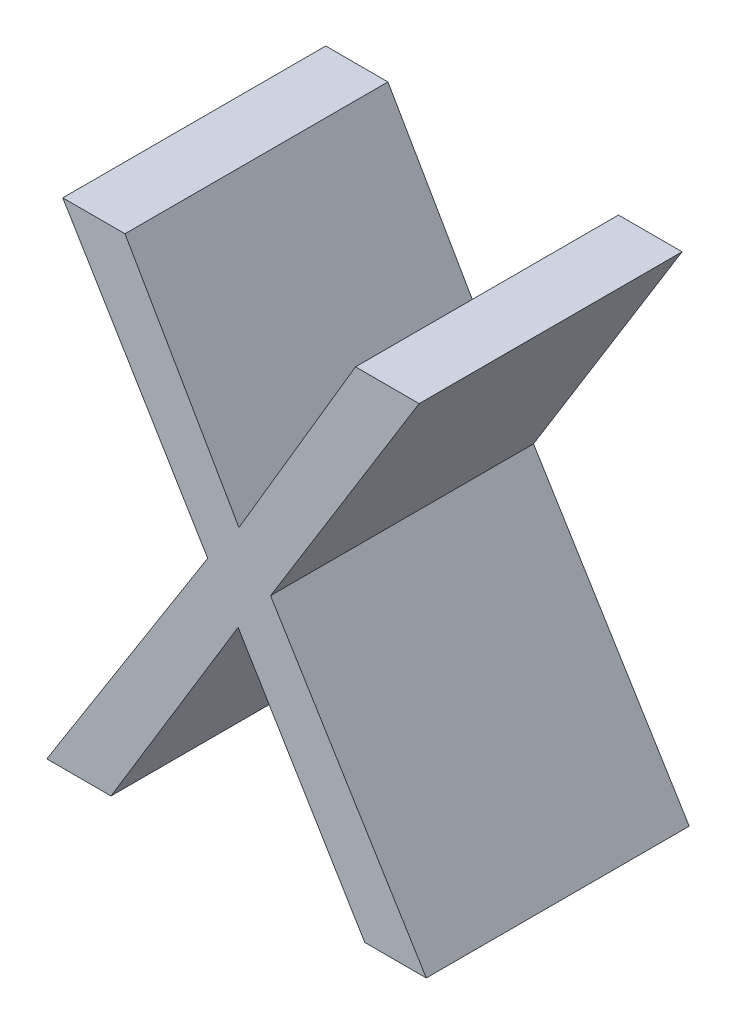
ISO-10303-21;
HEADER;
FILE_DESCRIPTION(('STEP AP214'),'2;1');
FILE_NAME('part.step','',(''),(''),'','','');
FILE_SCHEMA(('AUTOMOTIVE_DESIGN { 1 0 10303 214 1 1 1 1 }'));
ENDSEC;
DATA;
#1=APPLICATION_CONTEXT('core data for automotive mechanical design processes');
#2=APPLICATION_PROTOCOL_DEFINITION('international standard','automotive_design',2000,#1);
#3=PRODUCT_CONTEXT('',#1,'mechanical');
#4=PRODUCT('Part','Part','',(#3));
#5=PRODUCT_RELATED_PRODUCT_CATEGORY('part','',(#4));
#6=PRODUCT_DEFINITION_FORMATION('','',#4);
#7=PRODUCT_DEFINITION_CONTEXT('part definition',#1,'design');
#8=PRODUCT_DEFINITION('design','',#6,#7);
#9=PRODUCT_DEFINITION_SHAPE('','',#8);
#10=(LENGTH_UNIT() NAMED_UNIT(*) SI_UNIT(.MILLI.,.METRE.));
#11=(NAMED_UNIT(*) PLANE_ANGLE_UNIT() SI_UNIT($,.RADIAN.));
#12=(NAMED_UNIT(*) SI_UNIT($,.STERADIAN.) SOLID_ANGLE_UNIT());
#13=UNCERTAINTY_MEASURE_WITH_UNIT(LENGTH_MEASURE(1.E-05),#10,'distance_accuracy_value','');
#14=(GEOMETRIC_REPRESENTATION_CONTEXT(3) GLOBAL_UNCERTAINTY_ASSIGNED_CONTEXT((#13)) GLOBAL_UNIT_ASSIGNED_CONTEXT((#10,
#11,#12)) REPRESENTATION_CONTEXT('',''));
#15=CARTESIAN_POINT('',(0.,0.,0.));
#16=DIRECTION('',(0.,0.,1.));
#17=DIRECTION('',(1.,0.,0.));
#18=AXIS2_PLACEMENT_3D('',#15,#16,#17);
#19=CARTESIAN_POINT('',(-15.034738548345,-5.20300401796,-5.5));
#20=DIRECTION('',(0.,0.,1.));
#21=DIRECTION('',(0.,-1.,0.));
#22=AXIS2_PLACEMENT_3D('',#19,#20,#21);
#23=PLANE('',#22);
#24=DIRECTION('',(-0.523871496151556,0.85179730894147,0.));
#25=VECTOR('',#24,1.);
#26=CARTESIAN_POINT('',(-14.321526980301,-6.13847583919,-5.5));
#27=LINE('',#26,#25);
#28=CARTESIAN_POINT('',(-14.321526980301,-6.13847583919,-5.5));
#29=VERTEX_POINT('',#28);
#30=CARTESIAN_POINT('',(-14.913792891412,-5.175471528079,-5.5));
#31=VERTEX_POINT('',#30);
#32=EDGE_CURVE('E157',#29,#31,#27,.T.);
#33=ORIENTED_EDGE('',*,*,#32,.T.);
#34=DIRECTION('',(0.525450652449942,0.850824078079558,0.));
#35=VECTOR('',#34,1.);
#36=CARTESIAN_POINT('',(-14.913792891412,-5.175471528079,-5.5));
#37=LINE('',#36,#35);
#38=CARTESIAN_POINT('',(-14.348566691412,-4.260241794746,-5.5));
#39=VERTEX_POINT('',#38);
#40=EDGE_CURVE('E20',#31,#39,#37,.T.);
#41=ORIENTED_EDGE('',*,*,#40,.T.);
#42=DIRECTION('',(-1.,0.,0.));
#43=VECTOR('',#42,1.);
#44=CARTESIAN_POINT('',(-14.348566691412,-4.260241794746,-5.5));
#45=LINE('',#44,#43);
#46=CARTESIAN_POINT('',(-14.590614580301,-4.260241794746,-5.5));
#47=VERTEX_POINT('',#46);
#48=EDGE_CURVE('E167',#39,#47,#45,.T.);
#49=ORIENTED_EDGE('',*,*,#48,.T.);
#50=DIRECTION('',(-0.508285495192719,-0.86118862938191,0.));
#51=VECTOR('',#50,1.);
#52=CARTESIAN_POINT('',(-14.590614580301,-4.260241794746,-5.5));
#53=LINE('',#52,#51);
#54=CARTESIAN_POINT('',(-15.03388126919,-5.01126899474555,-5.5));
#55=VERTEX_POINT('',#54);
#56=EDGE_CURVE('E187',#47,#55,#53,.T.);
#57=ORIENTED_EDGE('',*,*,#56,.T.);
#58=DIRECTION('',(-0.499878349673019,0.866095627242269,0.));
#59=VECTOR('',#58,1.);
#60=CARTESIAN_POINT('',(-15.03388126919,-5.01126899474555,-5.5));
#61=LINE('',#60,#59);
#62=CARTESIAN_POINT('',(-15.467346380301,-4.260241794746,-5.5));
#63=VERTEX_POINT('',#62);
#64=EDGE_CURVE('E201',#55,#63,#61,.T.);
#65=ORIENTED_EDGE('',*,*,#64,.T.);
#66=DIRECTION('',(-1.,0.,0.));
#67=VECTOR('',#66,1.);
#68=CARTESIAN_POINT('',(-15.467346380301,-4.260241794746,-5.5));
#69=LINE('',#68,#67);
#70=CARTESIAN_POINT('',(-15.703953024746,-4.260241794746,-5.5));
#71=VERTEX_POINT('',#70);
#72=EDGE_CURVE('E171',#63,#71,#69,.T.);
#73=ORIENTED_EDGE('',*,*,#72,.T.);
#74=DIRECTION('',(0.517362494476925,-0.855766352054469,0.));
#75=VECTOR('',#74,1.);
#76=CARTESIAN_POINT('',(-15.703953024746,-4.260241794746,-5.5));
#77=LINE('',#76,#75);
#78=CARTESIAN_POINT('',(-15.152784313635,-5.171926816968,-5.5));
#79=VERTEX_POINT('',#78);
#80=EDGE_CURVE('E142',#71,#79,#77,.T.);
#81=ORIENTED_EDGE('',*,*,#80,.T.);
#82=DIRECTION('',(-0.534969795289568,-0.84487118433986,0.));
#83=VECTOR('',#82,1.);
#84=CARTESIAN_POINT('',(-15.152784313635,-5.171926816968,-5.5));
#85=LINE('',#84,#83);
#86=CARTESIAN_POINT('',(-15.764800135857,-6.13847583919,-5.5));
#87=VERTEX_POINT('',#86);
#88=EDGE_CURVE('E126',#79,#87,#85,.T.);
#89=ORIENTED_EDGE('',*,*,#88,.T.);
#90=DIRECTION('',(1.,0.,0.));
#91=VECTOR('',#90,1.);
#92=CARTESIAN_POINT('',(-15.764800135857,-6.13847583919,-5.5));
#93=LINE('',#92,#91);
#94=CARTESIAN_POINT('',(-15.520500113635,-6.13847583919,-5.5));
#95=VERTEX_POINT('',#94);
#96=EDGE_CURVE('E132',#87,#95,#93,.T.);
#97=ORIENTED_EDGE('',*,*,#96,.T.);
#98=DIRECTION('',(0.518670020840152,0.854974508088795,0.));
#99=VECTOR('',#98,1.);
#100=CARTESIAN_POINT('',(-15.520500113635,-6.13847583919,-5.5));
#101=LINE('',#100,#99);
#102=CARTESIAN_POINT('',(-15.037073202523,-5.341595994746,-5.5));
#103=VERTEX_POINT('',#102);
#104=EDGE_CURVE('E213',#95,#103,#101,.T.);
#105=ORIENTED_EDGE('',*,*,#104,.T.);
#106=DIRECTION('',(0.51733345020432,-0.855783910400105,0.));
#107=VECTOR('',#106,1.);
#108=CARTESIAN_POINT('',(-15.037073202523,-5.341595994746,-5.5));
#109=LINE('',#108,#107);
#110=CARTESIAN_POINT('',(-14.555348091412,-6.13847583919,-5.5));
#111=VERTEX_POINT('',#110);
#112=EDGE_CURVE('E214',#103,#111,#109,.T.);
#113=ORIENTED_EDGE('',*,*,#112,.T.);
#114=DIRECTION('',(1.,0.,0.));
#115=VECTOR('',#114,1.);
#116=CARTESIAN_POINT('',(-14.555348091412,-6.13847583919,-5.5));
#117=LINE('',#116,#115);
#118=EDGE_CURVE('E11',#111,#29,#117,.T.);
#119=ORIENTED_EDGE('',*,*,#118,.T.);
#120=EDGE_LOOP('',(#33,#41,#49,#57,#65,#73,#81,#89,#97,#105,#113,#119));
#121=FACE_BOUND('',#120,.T.);
#122=ADVANCED_FACE('F16',(#121),#23,.T.);
#123=CARTESIAN_POINT('',(-15.034738548345,-5.20300401796,-6.5));
#124=DIRECTION('',(0.,0.,1.));
#125=DIRECTION('',(0.,-1.,0.));
#126=AXIS2_PLACEMENT_3D('',#123,#124,#125);
#127=PLANE('',#126);
#128=DIRECTION('',(-0.523871496151556,0.85179730894147,0.));
#129=VECTOR('',#128,1.);
#130=CARTESIAN_POINT('',(-14.321526980301,-6.13847583919,-6.5));
#131=LINE('',#130,#129);
#132=CARTESIAN_POINT('',(-14.321526980301,-6.13847583919,-6.5));
#133=VERTEX_POINT('',#132);
#134=CARTESIAN_POINT('',(-14.913792891412,-5.175471528079,-6.5));
#135=VERTEX_POINT('',#134);
#136=EDGE_CURVE('E192',#133,#135,#131,.T.);
#137=ORIENTED_EDGE('',*,*,#136,.F.);
#138=DIRECTION('',(1.,0.,0.));
#139=VECTOR('',#138,1.);
#140=CARTESIAN_POINT('',(-14.555348091412,-6.13847583919,-6.5));
#141=LINE('',#140,#139);
#142=CARTESIAN_POINT('',(-14.555348091412,-6.13847583919,-6.5));
#143=VERTEX_POINT('',#142);
#144=EDGE_CURVE('E27',#143,#133,#141,.T.);
#145=ORIENTED_EDGE('',*,*,#144,.F.);
#146=DIRECTION('',(0.51733345020432,-0.855783910400105,0.));
#147=VECTOR('',#146,1.);
#148=CARTESIAN_POINT('',(-15.037073202523,-5.341595994746,-6.5));
#149=LINE('',#148,#147);
#150=CARTESIAN_POINT('',(-15.037073202523,-5.341595994746,-6.5));
#151=VERTEX_POINT('',#150);
#152=EDGE_CURVE('E208',#151,#143,#149,.T.);
#153=ORIENTED_EDGE('',*,*,#152,.F.);
#154=DIRECTION('',(0.518670020840152,0.854974508088795,0.));
#155=VECTOR('',#154,1.);
#156=CARTESIAN_POINT('',(-15.520500113635,-6.13847583919,-6.5));
#157=LINE('',#156,#155);
#158=CARTESIAN_POINT('',(-15.520500113635,-6.13847583919,-6.5));
#159=VERTEX_POINT('',#158);
#160=EDGE_CURVE('E120',#159,#151,#157,.T.);
#161=ORIENTED_EDGE('',*,*,#160,.F.);
#162=DIRECTION('',(1.,0.,0.));
#163=VECTOR('',#162,1.);
#164=CARTESIAN_POINT('',(-15.764800135857,-6.13847583919,-6.5));
#165=LINE('',#164,#163);
#166=CARTESIAN_POINT('',(-15.764800135857,-6.13847583919,-6.5));
#167=VERTEX_POINT('',#166);
#168=EDGE_CURVE('E112',#167,#159,#165,.T.);
#169=ORIENTED_EDGE('',*,*,#168,.F.);
#170=DIRECTION('',(-0.534969795289568,-0.84487118433986,0.));
#171=VECTOR('',#170,1.);
#172=CARTESIAN_POINT('',(-15.152784313635,-5.171926816968,-6.5));
#173=LINE('',#172,#171);
#174=CARTESIAN_POINT('',(-15.152784313635,-5.171926816968,-6.5));
#175=VERTEX_POINT('',#174);
#176=EDGE_CURVE('E117',#175,#167,#173,.T.);
#177=ORIENTED_EDGE('',*,*,#176,.F.);
#178=DIRECTION('',(0.517362494476925,-0.855766352054469,0.));
#179=VECTOR('',#178,1.);
#180=CARTESIAN_POINT('',(-15.703953024746,-4.260241794746,-6.5));
#181=LINE('',#180,#179);
#182=CARTESIAN_POINT('',(-15.703953024746,-4.260241794746,-6.5));
#183=VERTEX_POINT('',#182);
#184=EDGE_CURVE('E168',#183,#175,#181,.T.);
#185=ORIENTED_EDGE('',*,*,#184,.F.);
#186=DIRECTION('',(-1.,0.,0.));
#187=VECTOR('',#186,1.);
#188=CARTESIAN_POINT('',(-15.467346380301,-4.260241794746,-6.5));
#189=LINE('',#188,#187);
#190=CARTESIAN_POINT('',(-15.467346380301,-4.260241794746,-6.5));
#191=VERTEX_POINT('',#190);
#192=EDGE_CURVE('E182',#191,#183,#189,.T.);
#193=ORIENTED_EDGE('',*,*,#192,.F.);
#194=DIRECTION('',(-0.499878349673019,0.866095627242269,0.));
#195=VECTOR('',#194,1.);
#196=CARTESIAN_POINT('',(-15.03388126919,-5.01126899474555,-6.5));
#197=LINE('',#196,#195);
#198=CARTESIAN_POINT('',(-15.03388126919,-5.01126899474555,-6.5));
#199=VERTEX_POINT('',#198);
#200=EDGE_CURVE('E183',#199,#191,#197,.T.);
#201=ORIENTED_EDGE('',*,*,#200,.F.);
#202=DIRECTION('',(-0.508285495192719,-0.86118862938191,0.));
#203=VECTOR('',#202,1.);
#204=CARTESIAN_POINT('',(-14.590614580301,-4.260241794746,-6.5));
#205=LINE('',#204,#203);
#206=CARTESIAN_POINT('',(-14.590614580301,-4.260241794746,-6.5));
#207=VERTEX_POINT('',#206);
#208=EDGE_CURVE('E162',#207,#199,#205,.T.);
#209=ORIENTED_EDGE('',*,*,#208,.F.);
#210=DIRECTION('',(-1.,0.,0.));
#211=VECTOR('',#210,1.);
#212=CARTESIAN_POINT('',(-14.348566691412,-4.260241794746,-6.5));
#213=LINE('',#212,#211);
#214=CARTESIAN_POINT('',(-14.348566691412,-4.260241794746,-6.5));
#215=VERTEX_POINT('',#214);
#216=EDGE_CURVE('E204',#215,#207,#213,.T.);
#217=ORIENTED_EDGE('',*,*,#216,.F.);
#218=DIRECTION('',(0.525450652449942,0.850824078079558,0.));
#219=VECTOR('',#218,1.);
#220=CARTESIAN_POINT('',(-14.913792891412,-5.175471528079,-6.5));
#221=LINE('',#220,#219);
#222=EDGE_CURVE('E156',#135,#215,#221,.T.);
#223=ORIENTED_EDGE('',*,*,#222,.F.);
#224=EDGE_LOOP('',(#137,#145,#153,#161,#169,#177,#185,#193,#201,#209,#217,#223));
#225=FACE_BOUND('',#224,.T.);
#226=ADVANCED_FACE('F115',(#225),#127,.F.);
#227=CARTESIAN_POINT('',(-14.4384375358565,-6.13847583919,-5.49));
#228=DIRECTION('',(0.,1.,0.));
#229=DIRECTION('',(-1.,0.,0.));
#230=AXIS2_PLACEMENT_3D('',#227,#228,#229);
#231=PLANE('',#230);
#232=DIRECTION('',(0.,0.,1.));
#233=VECTOR('',#232,1.);
#234=CARTESIAN_POINT('',(-14.555348091412,-6.13847583919,-6.5));
#235=LINE('',#234,#233);
#236=EDGE_CURVE('E212',#143,#111,#235,.T.);
#237=ORIENTED_EDGE('',*,*,#236,.F.);
#238=ORIENTED_EDGE('',*,*,#144,.T.);
#239=DIRECTION('',(0.,0.,1.));
#240=VECTOR('',#239,1.);
#241=CARTESIAN_POINT('',(-14.321526980301,-6.13847583919,-6.5));
#242=LINE('',#241,#240);
#243=EDGE_CURVE('E236',#133,#29,#242,.T.);
#244=ORIENTED_EDGE('',*,*,#243,.T.);
#245=ORIENTED_EDGE('',*,*,#118,.F.);
#246=EDGE_LOOP('',(#237,#238,#244,#245));
#247=FACE_BOUND('',#246,.T.);
#248=ADVANCED_FACE('F18',(#247),#231,.F.);
#249=CARTESIAN_POINT('',(-14.7962106469675,-5.740035916968,-5.49));
#250=DIRECTION('',(0.855783910400104,0.517333450204322,0.));
#251=DIRECTION('',(0.,0.,-1.));
#252=AXIS2_PLACEMENT_3D('',#249,#250,#251);
#253=PLANE('',#252);
#254=DIRECTION('',(0.,0.,1.));
#255=VECTOR('',#254,1.);
#256=CARTESIAN_POINT('',(-15.037073202523,-5.341595994746,-6.5));
#257=LINE('',#256,#255);
#258=EDGE_CURVE('E219',#151,#103,#257,.T.);
#259=ORIENTED_EDGE('',*,*,#258,.F.);
#260=ORIENTED_EDGE('',*,*,#152,.T.);
#261=ORIENTED_EDGE('',*,*,#236,.T.);
#262=ORIENTED_EDGE('',*,*,#112,.F.);
#263=EDGE_LOOP('',(#259,#260,#261,#262));
#264=FACE_BOUND('',#263,.T.);
#265=ADVANCED_FACE('F234',(#264),#253,.F.);
#266=CARTESIAN_POINT('',(-15.278786658079,-5.740035916968,-5.49));
#267=DIRECTION('',(-0.854974508088793,0.518670020840154,0.));
#268=DIRECTION('',(0.,0.,1.));
#269=AXIS2_PLACEMENT_3D('',#266,#267,#268);
#270=PLANE('',#269);
#271=DIRECTION('',(0.,0.,1.));
#272=VECTOR('',#271,1.);
#273=CARTESIAN_POINT('',(-15.520500113635,-6.13847583919,-6.5));
#274=LINE('',#273,#272);
#275=EDGE_CURVE('E125',#159,#95,#274,.T.);
#276=ORIENTED_EDGE('',*,*,#275,.F.);
#277=ORIENTED_EDGE('',*,*,#160,.T.);
#278=ORIENTED_EDGE('',*,*,#258,.T.);
#279=ORIENTED_EDGE('',*,*,#104,.F.);
#280=EDGE_LOOP('',(#276,#277,#278,#279));
#281=FACE_BOUND('',#280,.T.);
#282=ADVANCED_FACE('F308',(#281),#270,.F.);
#283=CARTESIAN_POINT('',(-15.642650124746,-6.13847583919,-5.49));
#284=DIRECTION('',(0.,1.,0.));
#285=DIRECTION('',(-1.,0.,0.));
#286=AXIS2_PLACEMENT_3D('',#283,#284,#285);
#287=PLANE('',#286);
#288=DIRECTION('',(0.,0.,1.));
#289=VECTOR('',#288,1.);
#290=CARTESIAN_POINT('',(-15.764800135857,-6.13847583919,-6.5));
#291=LINE('',#290,#289);
#292=EDGE_CURVE('E129',#167,#87,#291,.T.);
#293=ORIENTED_EDGE('',*,*,#292,.F.);
#294=ORIENTED_EDGE('',*,*,#168,.T.);
#295=ORIENTED_EDGE('',*,*,#275,.T.);
#296=ORIENTED_EDGE('',*,*,#96,.F.);
#297=EDGE_LOOP('',(#293,#294,#295,#296));
#298=FACE_BOUND('',#297,.T.);
#299=ADVANCED_FACE('F130',(#298),#287,.F.);
#300=CARTESIAN_POINT('',(-15.458792224746,-5.655201328079,-5.49));
#301=DIRECTION('',(0.84487118433986,-0.534969795289569,0.));
#302=DIRECTION('',(0.534969795289569,0.84487118433986,0.));
#303=AXIS2_PLACEMENT_3D('',#300,#301,#302);
#304=PLANE('',#303);
#305=DIRECTION('',(0.,0.,1.));
#306=VECTOR('',#305,1.);
#307=CARTESIAN_POINT('',(-15.152784313635,-5.171926816968,-6.5));
#308=LINE('',#307,#306);
#309=EDGE_CURVE('E139',#175,#79,#308,.T.);
#310=ORIENTED_EDGE('',*,*,#309,.F.);
#311=ORIENTED_EDGE('',*,*,#176,.T.);
#312=ORIENTED_EDGE('',*,*,#292,.T.);
#313=ORIENTED_EDGE('',*,*,#88,.F.);
#314=EDGE_LOOP('',(#310,#311,#312,#313));
#315=FACE_BOUND('',#314,.T.);
#316=ADVANCED_FACE('F137',(#315),#304,.F.);
#317=CARTESIAN_POINT('',(-15.4283686691905,-4.716084305857,-5.49));
#318=DIRECTION('',(0.855766352054469,0.517362494476925,0.));
#319=DIRECTION('',(0.,0.,-1.));
#320=AXIS2_PLACEMENT_3D('',#317,#318,#319);
#321=PLANE('',#320);
#322=DIRECTION('',(0.,0.,1.));
#323=VECTOR('',#322,1.);
#324=CARTESIAN_POINT('',(-15.703953024746,-4.260241794746,-6.5));
#325=LINE('',#324,#323);
#326=EDGE_CURVE('E178',#183,#71,#325,.T.);
#327=ORIENTED_EDGE('',*,*,#326,.F.);
#328=ORIENTED_EDGE('',*,*,#184,.T.);
#329=ORIENTED_EDGE('',*,*,#309,.T.);
#330=ORIENTED_EDGE('',*,*,#80,.F.);
#331=EDGE_LOOP('',(#327,#328,#329,#330));
#332=FACE_BOUND('',#331,.T.);
#333=ADVANCED_FACE('F272',(#332),#321,.F.);
#334=CARTESIAN_POINT('',(-15.5856497025235,-4.260241794746,-5.49));
#335=DIRECTION('',(0.,-1.,0.));
#336=DIRECTION('',(0.,0.,1.));
#337=AXIS2_PLACEMENT_3D('',#334,#335,#336);
#338=PLANE('',#337);
#339=DIRECTION('',(0.,0.,1.));
#340=VECTOR('',#339,1.);
#341=CARTESIAN_POINT('',(-15.467346380301,-4.260241794746,-6.5));
#342=LINE('',#341,#340);
#343=EDGE_CURVE('E186',#191,#63,#342,.T.);
#344=ORIENTED_EDGE('',*,*,#343,.F.);
#345=ORIENTED_EDGE('',*,*,#192,.T.);
#346=ORIENTED_EDGE('',*,*,#326,.T.);
#347=ORIENTED_EDGE('',*,*,#72,.F.);
#348=EDGE_LOOP('',(#344,#345,#346,#347));
#349=FACE_BOUND('',#348,.T.);
#350=ADVANCED_FACE('F270',(#349),#338,.F.);
#351=CARTESIAN_POINT('',(-15.2506138247455,-4.63575539474578,-5.49));
#352=DIRECTION('',(-0.866095627242269,-0.499878349673019,0.));
#353=DIRECTION('',(0.,0.,1.));
#354=AXIS2_PLACEMENT_3D('',#351,#352,#353);
#355=PLANE('',#354);
#356=DIRECTION('',(0.,0.,1.));
#357=VECTOR('',#356,1.);
#358=CARTESIAN_POINT('',(-15.03388126919,-5.01126899474555,-6.5));
#359=LINE('',#358,#357);
#360=EDGE_CURVE('E166',#199,#55,#359,.T.);
#361=ORIENTED_EDGE('',*,*,#360,.F.);
#362=ORIENTED_EDGE('',*,*,#200,.T.);
#363=ORIENTED_EDGE('',*,*,#343,.T.);
#364=ORIENTED_EDGE('',*,*,#64,.F.);
#365=EDGE_LOOP('',(#361,#362,#363,#364));
#366=FACE_BOUND('',#365,.T.);
#367=ADVANCED_FACE('F276',(#366),#355,.F.);
#368=CARTESIAN_POINT('',(-14.8122479247455,-4.63575539474578,-5.49));
#369=DIRECTION('',(0.86118862938191,-0.508285495192719,0.));
#370=DIRECTION('',(0.508285495192719,0.86118862938191,0.));
#371=AXIS2_PLACEMENT_3D('',#368,#369,#370);
#372=PLANE('',#371);
#373=DIRECTION('',(0.,0.,1.));
#374=VECTOR('',#373,1.);
#375=CARTESIAN_POINT('',(-14.590614580301,-4.260241794746,-6.5));
#376=LINE('',#375,#374);
#377=EDGE_CURVE('E177',#207,#47,#376,.T.);
#378=ORIENTED_EDGE('',*,*,#377,.F.);
#379=ORIENTED_EDGE('',*,*,#208,.T.);
#380=ORIENTED_EDGE('',*,*,#360,.T.);
#381=ORIENTED_EDGE('',*,*,#56,.F.);
#382=EDGE_LOOP('',(#378,#379,#380,#381));
#383=FACE_BOUND('',#382,.T.);
#384=ADVANCED_FACE('F279',(#383),#372,.F.);
#385=CARTESIAN_POINT('',(-14.4695906358565,-4.260241794746,-5.49));
#386=DIRECTION('',(0.,-1.,0.));
#387=DIRECTION('',(0.,0.,1.));
#388=AXIS2_PLACEMENT_3D('',#385,#386,#387);
#389=PLANE('',#388);
#390=DIRECTION('',(0.,0.,1.));
#391=VECTOR('',#390,1.);
#392=CARTESIAN_POINT('',(-14.348566691412,-4.260241794746,-6.5));
#393=LINE('',#392,#391);
#394=EDGE_CURVE('E152',#215,#39,#393,.T.);
#395=ORIENTED_EDGE('',*,*,#394,.F.);
#396=ORIENTED_EDGE('',*,*,#216,.T.);
#397=ORIENTED_EDGE('',*,*,#377,.T.);
#398=ORIENTED_EDGE('',*,*,#48,.F.);
#399=EDGE_LOOP('',(#395,#396,#397,#398));
#400=FACE_BOUND('',#399,.T.);
#401=ADVANCED_FACE('F283',(#400),#389,.F.);
#402=CARTESIAN_POINT('',(-14.631179791412,-4.7178566614125,-5.49));
#403=DIRECTION('',(-0.850824078079558,0.525450652449942,0.));
#404=DIRECTION('',(0.,0.,1.));
#405=AXIS2_PLACEMENT_3D('',#402,#403,#404);
#406=PLANE('',#405);
#407=DIRECTION('',(0.,0.,1.));
#408=VECTOR('',#407,1.);
#409=CARTESIAN_POINT('',(-14.913792891412,-5.175471528079,-6.5));
#410=LINE('',#409,#408);
#411=EDGE_CURVE('E161',#135,#31,#410,.T.);
#412=ORIENTED_EDGE('',*,*,#411,.F.);
#413=ORIENTED_EDGE('',*,*,#222,.T.);
#414=ORIENTED_EDGE('',*,*,#394,.T.);
#415=ORIENTED_EDGE('',*,*,#40,.F.);
#416=EDGE_LOOP('',(#412,#413,#414,#415));
#417=FACE_BOUND('',#416,.T.);
#418=ADVANCED_FACE('F287',(#417),#406,.F.);
#419=CARTESIAN_POINT('',(-14.6176599358565,-5.6569736836345,-5.49));
#420=DIRECTION('',(-0.851797308941469,-0.523871496151558,0.));
#421=DIRECTION('',(0.,0.,1.));
#422=AXIS2_PLACEMENT_3D('',#419,#420,#421);
#423=PLANE('',#422);
#424=ORIENTED_EDGE('',*,*,#243,.F.);
#425=ORIENTED_EDGE('',*,*,#136,.T.);
#426=ORIENTED_EDGE('',*,*,#411,.T.);
#427=ORIENTED_EDGE('',*,*,#32,.F.);
#428=EDGE_LOOP('',(#424,#425,#426,#427));
#429=FACE_BOUND('',#428,.T.);
#430=ADVANCED_FACE('F245',(#429),#423,.F.);
#431=CLOSED_SHELL('',(#122,#226,#248,#265,#282,#299,#316,#333,#350,#367,#384,#401,#418,#430));
#432=MANIFOLD_SOLID_BREP('B1',#431);
#433=ADVANCED_BREP_SHAPE_REPRESENTATION('',(#18,#432),#14);
#434=SHAPE_DEFINITION_REPRESENTATION(#9,#433);
ENDSEC;
END-ISO-10303-21;
